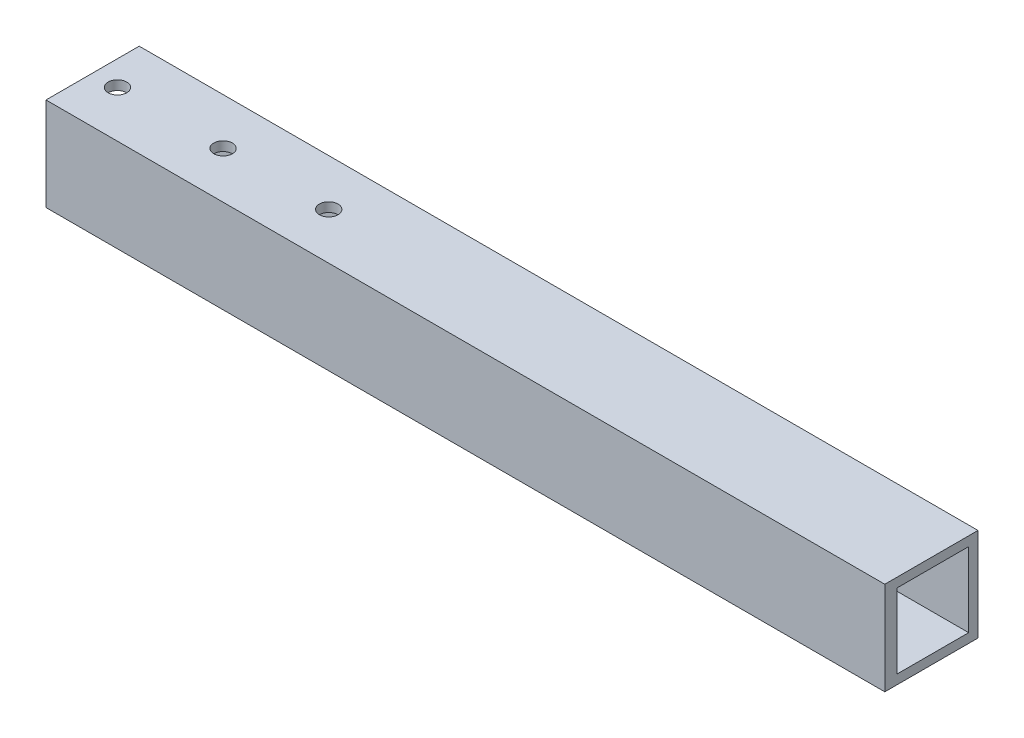
ISO-10303-21;
HEADER;
FILE_DESCRIPTION(('STEP AP214'),'2;1');
FILE_NAME('part.step','',(''),(''),'','','');
FILE_SCHEMA(('AUTOMOTIVE_DESIGN { 1 0 10303 214 1 1 1 1 }'));
ENDSEC;
DATA;
#1=APPLICATION_CONTEXT('core data for automotive mechanical design processes');
#2=APPLICATION_PROTOCOL_DEFINITION('international standard','automotive_design',2000,#1);
#3=PRODUCT_CONTEXT('',#1,'mechanical');
#4=PRODUCT('Part','Part','',(#3));
#5=PRODUCT_RELATED_PRODUCT_CATEGORY('part','',(#4));
#6=PRODUCT_DEFINITION_FORMATION('','',#4);
#7=PRODUCT_DEFINITION_CONTEXT('part definition',#1,'design');
#8=PRODUCT_DEFINITION('design','',#6,#7);
#9=PRODUCT_DEFINITION_SHAPE('','',#8);
#10=(LENGTH_UNIT() NAMED_UNIT(*) SI_UNIT(.MILLI.,.METRE.));
#11=(NAMED_UNIT(*) PLANE_ANGLE_UNIT() SI_UNIT($,.RADIAN.));
#12=(NAMED_UNIT(*) SI_UNIT($,.STERADIAN.) SOLID_ANGLE_UNIT());
#13=UNCERTAINTY_MEASURE_WITH_UNIT(LENGTH_MEASURE(1.E-05),#10,'distance_accuracy_value','');
#14=(GEOMETRIC_REPRESENTATION_CONTEXT(3) GLOBAL_UNCERTAINTY_ASSIGNED_CONTEXT((#13)) GLOBAL_UNIT_ASSIGNED_CONTEXT((#10,
#11,#12)) REPRESENTATION_CONTEXT('',''));
#15=CARTESIAN_POINT('',(0.,0.,0.));
#16=DIRECTION('',(0.,0.,1.));
#17=DIRECTION('',(1.,0.,0.));
#18=AXIS2_PLACEMENT_3D('',#15,#16,#17);
#19=CARTESIAN_POINT('',(135.,5.99999999999999,-3.50000000000001));
#20=DIRECTION('',(0.,-1.,0.));
#21=DIRECTION('',(0.,0.,-1.));
#22=AXIS2_PLACEMENT_3D('',#19,#20,#21);
#23=PLANE('',#22);
#24=CARTESIAN_POINT('',(38.,5.99999999999999,0.));
#25=DIRECTION('',(0.,-1.,0.));
#26=DIRECTION('',(0.,0.,-1.));
#27=AXIS2_PLACEMENT_3D('',#24,#25,#26);
#28=CIRCLE('',#27,1.5);
#29=CARTESIAN_POINT('',(38.,5.99999999999999,-1.5));
#30=VERTEX_POINT('',#29);
#31=EDGE_CURVE('E187',#30,#30,#28,.T.);
#32=ORIENTED_EDGE('',*,*,#31,.F.);
#33=EDGE_LOOP('',(#32));
#34=FACE_BOUND('',#33,.T.);
#35=CARTESIAN_POINT('',(4.,5.99999999999999,0.));
#36=DIRECTION('',(0.,-1.,0.));
#37=DIRECTION('',(0.,0.,-1.));
#38=AXIS2_PLACEMENT_3D('',#35,#36,#37);
#39=CIRCLE('',#38,1.5);
#40=CARTESIAN_POINT('',(4.,5.99999999999999,-1.5));
#41=VERTEX_POINT('',#40);
#42=EDGE_CURVE('E325',#41,#41,#39,.T.);
#43=ORIENTED_EDGE('',*,*,#42,.F.);
#44=EDGE_LOOP('',(#43));
#45=FACE_BOUND('',#44,.T.);
#46=CARTESIAN_POINT('',(21.,5.99999999999999,0.));
#47=DIRECTION('',(0.,-1.,0.));
#48=DIRECTION('',(0.,0.,-1.));
#49=AXIS2_PLACEMENT_3D('',#46,#47,#48);
#50=CIRCLE('',#49,1.5);
#51=CARTESIAN_POINT('',(21.,5.99999999999999,-1.5));
#52=VERTEX_POINT('',#51);
#53=EDGE_CURVE('E317',#52,#52,#50,.T.);
#54=ORIENTED_EDGE('',*,*,#53,.F.);
#55=EDGE_LOOP('',(#54));
#56=FACE_BOUND('',#55,.T.);
#57=DIRECTION('',(0.,0.,1.));
#58=VECTOR('',#57,1.);
#59=CARTESIAN_POINT('',(0.,5.99999999999999,-3.50000000000001));
#60=LINE('',#59,#58);
#61=CARTESIAN_POINT('',(0.,5.99999999999999,-6.));
#62=VERTEX_POINT('',#61);
#63=CARTESIAN_POINT('',(0.,5.99999999999999,5.50000000000001));
#64=VERTEX_POINT('',#63);
#65=EDGE_CURVE('E131',#62,#64,#60,.T.);
#66=ORIENTED_EDGE('',*,*,#65,.F.);
#67=DIRECTION('',(-1.,0.,0.));
#68=VECTOR('',#67,1.);
#69=CARTESIAN_POINT('',(135.,5.99999999999999,-6.));
#70=LINE('',#69,#68);
#71=CARTESIAN_POINT('',(135.,5.99999999999999,-6.));
#72=VERTEX_POINT('',#71);
#73=EDGE_CURVE('E12',#72,#62,#70,.T.);
#74=ORIENTED_EDGE('',*,*,#73,.F.);
#75=DIRECTION('',(0.,0.,1.));
#76=VECTOR('',#75,1.);
#77=CARTESIAN_POINT('',(135.,5.99999999999999,5.50000000000001));
#78=LINE('',#77,#76);
#79=CARTESIAN_POINT('',(135.,5.99999999999999,5.50000000000001));
#80=VERTEX_POINT('',#79);
#81=EDGE_CURVE('E160',#72,#80,#78,.T.);
#82=ORIENTED_EDGE('',*,*,#81,.T.);
#83=DIRECTION('',(-1.,0.,0.));
#84=VECTOR('',#83,1.);
#85=CARTESIAN_POINT('',(135.,5.99999999999999,5.50000000000001));
#86=LINE('',#85,#84);
#87=EDGE_CURVE('E209',#80,#64,#86,.T.);
#88=ORIENTED_EDGE('',*,*,#87,.T.);
#89=EDGE_LOOP('',(#66,#74,#82,#88));
#90=FACE_BOUND('',#89,.T.);
#91=ADVANCED_FACE('F79',(#34,#45,#56,#90),#23,.T.);
#92=CARTESIAN_POINT('',(135.,-6.00000000000001,-6.));
#93=DIRECTION('',(0.,0.,1.));
#94=DIRECTION('',(0.,-1.,0.));
#95=AXIS2_PLACEMENT_3D('',#92,#93,#94);
#96=PLANE('',#95);
#97=DIRECTION('',(0.,1.,0.));
#98=VECTOR('',#97,1.);
#99=CARTESIAN_POINT('',(0.,-6.00000000000001,-6.));
#100=LINE('',#99,#98);
#101=CARTESIAN_POINT('',(0.,-6.00000000000001,-6.));
#102=VERTEX_POINT('',#101);
#103=EDGE_CURVE('E168',#102,#62,#100,.T.);
#104=ORIENTED_EDGE('',*,*,#103,.F.);
#105=DIRECTION('',(-1.,0.,0.));
#106=VECTOR('',#105,1.);
#107=CARTESIAN_POINT('',(135.,-6.00000000000001,-6.));
#108=LINE('',#107,#106);
#109=CARTESIAN_POINT('',(135.,-6.00000000000001,-6.));
#110=VERTEX_POINT('',#109);
#111=EDGE_CURVE('E90',#110,#102,#108,.T.);
#112=ORIENTED_EDGE('',*,*,#111,.F.);
#113=DIRECTION('',(0.,1.,0.));
#114=VECTOR('',#113,1.);
#115=CARTESIAN_POINT('',(135.,5.99999999999999,-6.));
#116=LINE('',#115,#114);
#117=EDGE_CURVE('E153',#110,#72,#116,.T.);
#118=ORIENTED_EDGE('',*,*,#117,.T.);
#119=ORIENTED_EDGE('',*,*,#73,.T.);
#120=EDGE_LOOP('',(#104,#112,#118,#119));
#121=FACE_BOUND('',#120,.T.);
#122=ADVANCED_FACE('F167',(#121),#96,.T.);
#123=CARTESIAN_POINT('',(135.,-6.00000000000001,5.50000000000001));
#124=DIRECTION('',(0.,1.,0.));
#125=DIRECTION('',(0.,0.,1.));
#126=AXIS2_PLACEMENT_3D('',#123,#124,#125);
#127=PLANE('',#126);
#128=CARTESIAN_POINT('',(38.,-6.00000000000001,0.));
#129=DIRECTION('',(0.,1.,0.));
#130=DIRECTION('',(0.,0.,1.));
#131=AXIS2_PLACEMENT_3D('',#128,#129,#130);
#132=CIRCLE('',#131,1.5);
#133=CARTESIAN_POINT('',(38.,-6.00000000000001,1.5));
#134=VERTEX_POINT('',#133);
#135=EDGE_CURVE('E329',#134,#134,#132,.T.);
#136=ORIENTED_EDGE('',*,*,#135,.F.);
#137=EDGE_LOOP('',(#136));
#138=FACE_BOUND('',#137,.T.);
#139=CARTESIAN_POINT('',(4.,-6.00000000000001,0.));
#140=DIRECTION('',(0.,1.,0.));
#141=DIRECTION('',(0.,0.,1.));
#142=AXIS2_PLACEMENT_3D('',#139,#140,#141);
#143=CIRCLE('',#142,1.5);
#144=CARTESIAN_POINT('',(4.,-6.00000000000001,1.5));
#145=VERTEX_POINT('',#144);
#146=EDGE_CURVE('E321',#145,#145,#143,.T.);
#147=ORIENTED_EDGE('',*,*,#146,.F.);
#148=EDGE_LOOP('',(#147));
#149=FACE_BOUND('',#148,.T.);
#150=CARTESIAN_POINT('',(21.,-6.00000000000001,0.));
#151=DIRECTION('',(0.,1.,0.));
#152=DIRECTION('',(0.,0.,1.));
#153=AXIS2_PLACEMENT_3D('',#150,#151,#152);
#154=CIRCLE('',#153,1.5);
#155=CARTESIAN_POINT('',(21.,-6.00000000000001,1.5));
#156=VERTEX_POINT('',#155);
#157=EDGE_CURVE('E313',#156,#156,#154,.T.);
#158=ORIENTED_EDGE('',*,*,#157,.F.);
#159=EDGE_LOOP('',(#158));
#160=FACE_BOUND('',#159,.T.);
#161=DIRECTION('',(0.,0.,-1.));
#162=VECTOR('',#161,1.);
#163=CARTESIAN_POINT('',(0.,-6.00000000000001,5.50000000000001));
#164=LINE('',#163,#162);
#165=CARTESIAN_POINT('',(0.,-6.00000000000001,5.50000000000001));
#166=VERTEX_POINT('',#165);
#167=EDGE_CURVE('E203',#166,#102,#164,.T.);
#168=ORIENTED_EDGE('',*,*,#167,.F.);
#169=DIRECTION('',(-1.,0.,0.));
#170=VECTOR('',#169,1.);
#171=CARTESIAN_POINT('',(135.,-6.00000000000001,5.50000000000001));
#172=LINE('',#171,#170);
#173=CARTESIAN_POINT('',(135.,-6.00000000000001,5.50000000000001));
#174=VERTEX_POINT('',#173);
#175=EDGE_CURVE('E172',#174,#166,#172,.T.);
#176=ORIENTED_EDGE('',*,*,#175,.F.);
#177=DIRECTION('',(0.,0.,-1.));
#178=VECTOR('',#177,1.);
#179=CARTESIAN_POINT('',(135.,-6.,-4.00000000000001));
#180=LINE('',#179,#178);
#181=EDGE_CURVE('E157',#174,#110,#180,.T.);
#182=ORIENTED_EDGE('',*,*,#181,.T.);
#183=ORIENTED_EDGE('',*,*,#111,.T.);
#184=EDGE_LOOP('',(#168,#176,#182,#183));
#185=FACE_BOUND('',#184,.T.);
#186=ADVANCED_FACE('F174',(#138,#149,#160,#185),#127,.T.);
#187=CARTESIAN_POINT('',(135.,7.49999999999999,7.50000000000001));
#188=DIRECTION('',(0.,-1.,0.));
#189=DIRECTION('',(0.,0.,-1.));
#190=AXIS2_PLACEMENT_3D('',#187,#188,#189);
#191=PLANE('',#190);
#192=CARTESIAN_POINT('',(38.,7.49999999999999,0.));
#193=DIRECTION('',(0.,-1.,0.));
#194=DIRECTION('',(0.,0.,-1.));
#195=AXIS2_PLACEMENT_3D('',#192,#193,#194);
#196=CIRCLE('',#195,1.5);
#197=CARTESIAN_POINT('',(38.,7.49999999999999,-1.5));
#198=VERTEX_POINT('',#197);
#199=EDGE_CURVE('E292',#198,#198,#196,.T.);
#200=ORIENTED_EDGE('',*,*,#199,.T.);
#201=EDGE_LOOP('',(#200));
#202=FACE_BOUND('',#201,.T.);
#203=CARTESIAN_POINT('',(4.,7.49999999999999,0.));
#204=DIRECTION('',(0.,-1.,0.));
#205=DIRECTION('',(0.,0.,-1.));
#206=AXIS2_PLACEMENT_3D('',#203,#204,#205);
#207=CIRCLE('',#206,1.5);
#208=CARTESIAN_POINT('',(4.,7.49999999999999,-1.5));
#209=VERTEX_POINT('',#208);
#210=EDGE_CURVE('E296',#209,#209,#207,.T.);
#211=ORIENTED_EDGE('',*,*,#210,.T.);
#212=EDGE_LOOP('',(#211));
#213=FACE_BOUND('',#212,.T.);
#214=CARTESIAN_POINT('',(21.,7.49999999999999,0.));
#215=DIRECTION('',(0.,-1.,0.));
#216=DIRECTION('',(0.,0.,-1.));
#217=AXIS2_PLACEMENT_3D('',#214,#215,#216);
#218=CIRCLE('',#217,1.5);
#219=CARTESIAN_POINT('',(21.,7.49999999999999,-1.5));
#220=VERTEX_POINT('',#219);
#221=EDGE_CURVE('E299',#220,#220,#218,.T.);
#222=ORIENTED_EDGE('',*,*,#221,.T.);
#223=EDGE_LOOP('',(#222));
#224=FACE_BOUND('',#223,.T.);
#225=DIRECTION('',(0.,0.,1.));
#226=VECTOR('',#225,1.);
#227=CARTESIAN_POINT('',(0.,7.49999999999999,7.50000000000001));
#228=LINE('',#227,#226);
#229=CARTESIAN_POINT('',(0.,7.49999999999999,-7.5));
#230=VERTEX_POINT('',#229);
#231=CARTESIAN_POINT('',(0.,7.49999999999999,7.50000000000001));
#232=VERTEX_POINT('',#231);
#233=EDGE_CURVE('E182',#230,#232,#228,.T.);
#234=ORIENTED_EDGE('',*,*,#233,.T.);
#235=DIRECTION('',(-1.,0.,0.));
#236=VECTOR('',#235,1.);
#237=CARTESIAN_POINT('',(135.,7.49999999999999,7.50000000000001));
#238=LINE('',#237,#236);
#239=CARTESIAN_POINT('',(135.,7.49999999999999,7.50000000000001));
#240=VERTEX_POINT('',#239);
#241=EDGE_CURVE('E220',#240,#232,#238,.T.);
#242=ORIENTED_EDGE('',*,*,#241,.F.);
#243=DIRECTION('',(0.,0.,1.));
#244=VECTOR('',#243,1.);
#245=CARTESIAN_POINT('',(135.,7.49999999999999,-6.));
#246=LINE('',#245,#244);
#247=CARTESIAN_POINT('',(135.,7.49999999999999,-7.5));
#248=VERTEX_POINT('',#247);
#249=EDGE_CURVE('E140',#248,#240,#246,.T.);
#250=ORIENTED_EDGE('',*,*,#249,.F.);
#251=DIRECTION('',(-1.,0.,0.));
#252=VECTOR('',#251,1.);
#253=CARTESIAN_POINT('',(135.,7.49999999999999,-7.5));
#254=LINE('',#253,#252);
#255=EDGE_CURVE('E83',#248,#230,#254,.T.);
#256=ORIENTED_EDGE('',*,*,#255,.T.);
#257=EDGE_LOOP('',(#234,#242,#250,#256));
#258=FACE_BOUND('',#257,.T.);
#259=ADVANCED_FACE('F81',(#202,#213,#224,#258),#191,.F.);
#260=CARTESIAN_POINT('',(135.,-6.00000000000001,7.50000000000001));
#261=DIRECTION('',(0.,0.,-1.));
#262=DIRECTION('',(-1.,0.,0.));
#263=AXIS2_PLACEMENT_3D('',#260,#261,#262);
#264=PLANE('',#263);
#265=DIRECTION('',(0.,-1.,0.));
#266=VECTOR('',#265,1.);
#267=CARTESIAN_POINT('',(0.,-6.00000000000001,7.50000000000001));
#268=LINE('',#267,#266);
#269=CARTESIAN_POINT('',(0.,-7.50000000000001,7.50000000000001));
#270=VERTEX_POINT('',#269);
#271=EDGE_CURVE('E186',#232,#270,#268,.T.);
#272=ORIENTED_EDGE('',*,*,#271,.T.);
#273=DIRECTION('',(-1.,0.,0.));
#274=VECTOR('',#273,1.);
#275=CARTESIAN_POINT('',(135.,-7.50000000000001,7.50000000000001));
#276=LINE('',#275,#274);
#277=CARTESIAN_POINT('',(135.,-7.50000000000001,7.50000000000001));
#278=VERTEX_POINT('',#277);
#279=EDGE_CURVE('E217',#278,#270,#276,.T.);
#280=ORIENTED_EDGE('',*,*,#279,.F.);
#281=DIRECTION('',(0.,-1.,0.));
#282=VECTOR('',#281,1.);
#283=CARTESIAN_POINT('',(135.,6.00000000000001,7.50000000000001));
#284=LINE('',#283,#282);
#285=EDGE_CURVE('E239',#240,#278,#284,.T.);
#286=ORIENTED_EDGE('',*,*,#285,.F.);
#287=ORIENTED_EDGE('',*,*,#241,.T.);
#288=EDGE_LOOP('',(#272,#280,#286,#287));
#289=FACE_BOUND('',#288,.T.);
#290=ADVANCED_FACE('F238',(#289),#264,.F.);
#291=CARTESIAN_POINT('',(135.,-7.5,-7.5));
#292=DIRECTION('',(0.,1.,0.));
#293=DIRECTION('',(0.,0.,1.));
#294=AXIS2_PLACEMENT_3D('',#291,#292,#293);
#295=PLANE('',#294);
#296=CARTESIAN_POINT('',(38.,-7.5,0.));
#297=DIRECTION('',(0.,-1.,0.));
#298=DIRECTION('',(0.,0.,-1.));
#299=AXIS2_PLACEMENT_3D('',#296,#297,#298);
#300=CIRCLE('',#299,1.5);
#301=CARTESIAN_POINT('',(38.,-7.5,-1.5));
#302=VERTEX_POINT('',#301);
#303=EDGE_CURVE('E338',#302,#302,#300,.T.);
#304=ORIENTED_EDGE('',*,*,#303,.F.);
#305=EDGE_LOOP('',(#304));
#306=FACE_BOUND('',#305,.T.);
#307=CARTESIAN_POINT('',(4.,-7.5,0.));
#308=DIRECTION('',(0.,-1.,0.));
#309=DIRECTION('',(0.,0.,-1.));
#310=AXIS2_PLACEMENT_3D('',#307,#308,#309);
#311=CIRCLE('',#310,1.5);
#312=CARTESIAN_POINT('',(4.,-7.5,-1.5));
#313=VERTEX_POINT('',#312);
#314=EDGE_CURVE('E302',#313,#313,#311,.T.);
#315=ORIENTED_EDGE('',*,*,#314,.F.);
#316=EDGE_LOOP('',(#315));
#317=FACE_BOUND('',#316,.T.);
#318=CARTESIAN_POINT('',(21.,-7.5,0.));
#319=DIRECTION('',(0.,-1.,0.));
#320=DIRECTION('',(0.,0.,-1.));
#321=AXIS2_PLACEMENT_3D('',#318,#319,#320);
#322=CIRCLE('',#321,1.5);
#323=CARTESIAN_POINT('',(21.,-7.5,-1.5));
#324=VERTEX_POINT('',#323);
#325=EDGE_CURVE('E303',#324,#324,#322,.T.);
#326=ORIENTED_EDGE('',*,*,#325,.F.);
#327=EDGE_LOOP('',(#326));
#328=FACE_BOUND('',#327,.T.);
#329=DIRECTION('',(0.,0.,-1.));
#330=VECTOR('',#329,1.);
#331=CARTESIAN_POINT('',(0.,-7.5,-7.5));
#332=LINE('',#331,#330);
#333=CARTESIAN_POINT('',(0.,-7.5,-7.5));
#334=VERTEX_POINT('',#333);
#335=EDGE_CURVE('E191',#270,#334,#332,.T.);
#336=ORIENTED_EDGE('',*,*,#335,.T.);
#337=DIRECTION('',(-1.,0.,0.));
#338=VECTOR('',#337,1.);
#339=CARTESIAN_POINT('',(135.,-7.5,-7.5));
#340=LINE('',#339,#338);
#341=CARTESIAN_POINT('',(135.,-7.5,-7.5));
#342=VERTEX_POINT('',#341);
#343=EDGE_CURVE('E178',#342,#334,#340,.T.);
#344=ORIENTED_EDGE('',*,*,#343,.F.);
#345=DIRECTION('',(0.,0.,-1.));
#346=VECTOR('',#345,1.);
#347=CARTESIAN_POINT('',(135.,-7.50000000000001,7.50000000000001));
#348=LINE('',#347,#346);
#349=EDGE_CURVE('E237',#278,#342,#348,.T.);
#350=ORIENTED_EDGE('',*,*,#349,.F.);
#351=ORIENTED_EDGE('',*,*,#279,.T.);
#352=EDGE_LOOP('',(#336,#344,#350,#351));
#353=FACE_BOUND('',#352,.T.);
#354=ADVANCED_FACE('F234',(#306,#317,#328,#353),#295,.F.);
#355=CARTESIAN_POINT('',(135.,6.,-7.50000000000001));
#356=DIRECTION('',(0.,0.,1.));
#357=DIRECTION('',(0.,-1.,0.));
#358=AXIS2_PLACEMENT_3D('',#355,#356,#357);
#359=PLANE('',#358);
#360=DIRECTION('',(0.,1.,0.));
#361=VECTOR('',#360,1.);
#362=CARTESIAN_POINT('',(0.,6.,-7.50000000000001));
#363=LINE('',#362,#361);
#364=EDGE_CURVE('E195',#334,#230,#363,.T.);
#365=ORIENTED_EDGE('',*,*,#364,.T.);
#366=ORIENTED_EDGE('',*,*,#255,.F.);
#367=DIRECTION('',(0.,1.,0.));
#368=VECTOR('',#367,1.);
#369=CARTESIAN_POINT('',(135.,7.49999999999999,-7.5));
#370=LINE('',#369,#368);
#371=EDGE_CURVE('E208',#342,#248,#370,.T.);
#372=ORIENTED_EDGE('',*,*,#371,.F.);
#373=ORIENTED_EDGE('',*,*,#343,.T.);
#374=EDGE_LOOP('',(#365,#366,#372,#373));
#375=FACE_BOUND('',#374,.T.);
#376=ADVANCED_FACE('F229',(#375),#359,.F.);
#377=CARTESIAN_POINT('',(135.,3.5,5.50000000000001));
#378=DIRECTION('',(0.,0.,-1.));
#379=DIRECTION('',(0.,1.,0.));
#380=AXIS2_PLACEMENT_3D('',#377,#378,#379);
#381=PLANE('',#380);
#382=DIRECTION('',(0.,-1.,0.));
#383=VECTOR('',#382,1.);
#384=CARTESIAN_POINT('',(0.,3.5,5.50000000000001));
#385=LINE('',#384,#383);
#386=EDGE_CURVE('E127',#64,#166,#385,.T.);
#387=ORIENTED_EDGE('',*,*,#386,.F.);
#388=ORIENTED_EDGE('',*,*,#87,.F.);
#389=DIRECTION('',(0.,-1.,0.));
#390=VECTOR('',#389,1.);
#391=CARTESIAN_POINT('',(135.,-3.5,5.50000000000001));
#392=LINE('',#391,#390);
#393=EDGE_CURVE('E99',#80,#174,#392,.T.);
#394=ORIENTED_EDGE('',*,*,#393,.T.);
#395=ORIENTED_EDGE('',*,*,#175,.T.);
#396=EDGE_LOOP('',(#387,#388,#394,#395));
#397=FACE_BOUND('',#396,.T.);
#398=ADVANCED_FACE('F251',(#397),#381,.T.);
#399=CARTESIAN_POINT('',(135.,0.,0.));
#400=DIRECTION('',(-1.,0.,0.));
#401=DIRECTION('',(0.,0.,1.));
#402=AXIS2_PLACEMENT_3D('',#399,#400,#401);
#403=PLANE('',#402);
#404=ORIENTED_EDGE('',*,*,#371,.T.);
#405=ORIENTED_EDGE('',*,*,#249,.T.);
#406=ORIENTED_EDGE('',*,*,#285,.T.);
#407=ORIENTED_EDGE('',*,*,#349,.T.);
#408=EDGE_LOOP('',(#404,#405,#406,#407));
#409=FACE_BOUND('',#408,.T.);
#410=ORIENTED_EDGE('',*,*,#81,.F.);
#411=ORIENTED_EDGE('',*,*,#117,.F.);
#412=ORIENTED_EDGE('',*,*,#181,.F.);
#413=ORIENTED_EDGE('',*,*,#393,.F.);
#414=EDGE_LOOP('',(#410,#411,#412,#413));
#415=FACE_BOUND('',#414,.T.);
#416=ADVANCED_FACE('F155',(#409,#415),#403,.F.);
#417=CARTESIAN_POINT('',(0.,0.,0.));
#418=DIRECTION('',(-1.,0.,0.));
#419=DIRECTION('',(0.,0.,1.));
#420=AXIS2_PLACEMENT_3D('',#417,#418,#419);
#421=PLANE('',#420);
#422=ORIENTED_EDGE('',*,*,#233,.F.);
#423=ORIENTED_EDGE('',*,*,#364,.F.);
#424=ORIENTED_EDGE('',*,*,#335,.F.);
#425=ORIENTED_EDGE('',*,*,#271,.F.);
#426=EDGE_LOOP('',(#422,#423,#424,#425));
#427=FACE_BOUND('',#426,.T.);
#428=ORIENTED_EDGE('',*,*,#65,.T.);
#429=ORIENTED_EDGE('',*,*,#386,.T.);
#430=ORIENTED_EDGE('',*,*,#167,.T.);
#431=ORIENTED_EDGE('',*,*,#103,.T.);
#432=EDGE_LOOP('',(#428,#429,#430,#431));
#433=FACE_BOUND('',#432,.T.);
#434=ADVANCED_FACE('F232',(#427,#433),#421,.T.);
#435=CARTESIAN_POINT('',(21.,7.49999999999999,0.));
#436=DIRECTION('',(0.,-1.,0.));
#437=DIRECTION('',(0.,0.,-1.));
#438=AXIS2_PLACEMENT_3D('',#435,#436,#437);
#439=CYLINDRICAL_SURFACE('',#438,1.5);
#440=ORIENTED_EDGE('',*,*,#157,.T.);
#441=EDGE_LOOP('',(#440));
#442=FACE_BOUND('',#441,.T.);
#443=ORIENTED_EDGE('',*,*,#325,.T.);
#444=EDGE_LOOP('',(#443));
#445=FACE_BOUND('',#444,.T.);
#446=ADVANCED_FACE('F253',(#442,#445),#439,.F.);
#447=CARTESIAN_POINT('',(4.,7.49999999999999,0.));
#448=DIRECTION('',(0.,-1.,0.));
#449=DIRECTION('',(0.,0.,-1.));
#450=AXIS2_PLACEMENT_3D('',#447,#448,#449);
#451=CYLINDRICAL_SURFACE('',#450,1.5);
#452=ORIENTED_EDGE('',*,*,#146,.T.);
#453=EDGE_LOOP('',(#452));
#454=FACE_BOUND('',#453,.T.);
#455=ORIENTED_EDGE('',*,*,#314,.T.);
#456=EDGE_LOOP('',(#455));
#457=FACE_BOUND('',#456,.T.);
#458=ADVANCED_FACE('F259',(#454,#457),#451,.F.);
#459=CARTESIAN_POINT('',(38.,7.49999999999999,0.));
#460=DIRECTION('',(0.,-1.,0.));
#461=DIRECTION('',(0.,0.,-1.));
#462=AXIS2_PLACEMENT_3D('',#459,#460,#461);
#463=CYLINDRICAL_SURFACE('',#462,1.5);
#464=ORIENTED_EDGE('',*,*,#135,.T.);
#465=EDGE_LOOP('',(#464));
#466=FACE_BOUND('',#465,.T.);
#467=ORIENTED_EDGE('',*,*,#303,.T.);
#468=EDGE_LOOP('',(#467));
#469=FACE_BOUND('',#468,.T.);
#470=ADVANCED_FACE('F345',(#466,#469),#463,.F.);
#471=ORIENTED_EDGE('',*,*,#53,.T.);
#472=EDGE_LOOP('',(#471));
#473=FACE_BOUND('',#472,.T.);
#474=ORIENTED_EDGE('',*,*,#221,.F.);
#475=EDGE_LOOP('',(#474));
#476=FACE_BOUND('',#475,.T.);
#477=ADVANCED_FACE('F262',(#473,#476),#439,.F.);
#478=ORIENTED_EDGE('',*,*,#42,.T.);
#479=EDGE_LOOP('',(#478));
#480=FACE_BOUND('',#479,.T.);
#481=ORIENTED_EDGE('',*,*,#210,.F.);
#482=EDGE_LOOP('',(#481));
#483=FACE_BOUND('',#482,.T.);
#484=ADVANCED_FACE('F355',(#480,#483),#451,.F.);
#485=ORIENTED_EDGE('',*,*,#31,.T.);
#486=EDGE_LOOP('',(#485));
#487=FACE_BOUND('',#486,.T.);
#488=ORIENTED_EDGE('',*,*,#199,.F.);
#489=EDGE_LOOP('',(#488));
#490=FACE_BOUND('',#489,.T.);
#491=ADVANCED_FACE('F361',(#487,#490),#463,.F.);
#492=CLOSED_SHELL('',(#91,#122,#186,#259,#290,#354,#376,#398,#416,#434,#446,#458,#470,#477,#484,#491));
#493=MANIFOLD_SOLID_BREP('B2',#492);
#494=ADVANCED_BREP_SHAPE_REPRESENTATION('',(#18,#493),#14);
#495=SHAPE_DEFINITION_REPRESENTATION(#9,#494);
ENDSEC;
END-ISO-10303-21;
